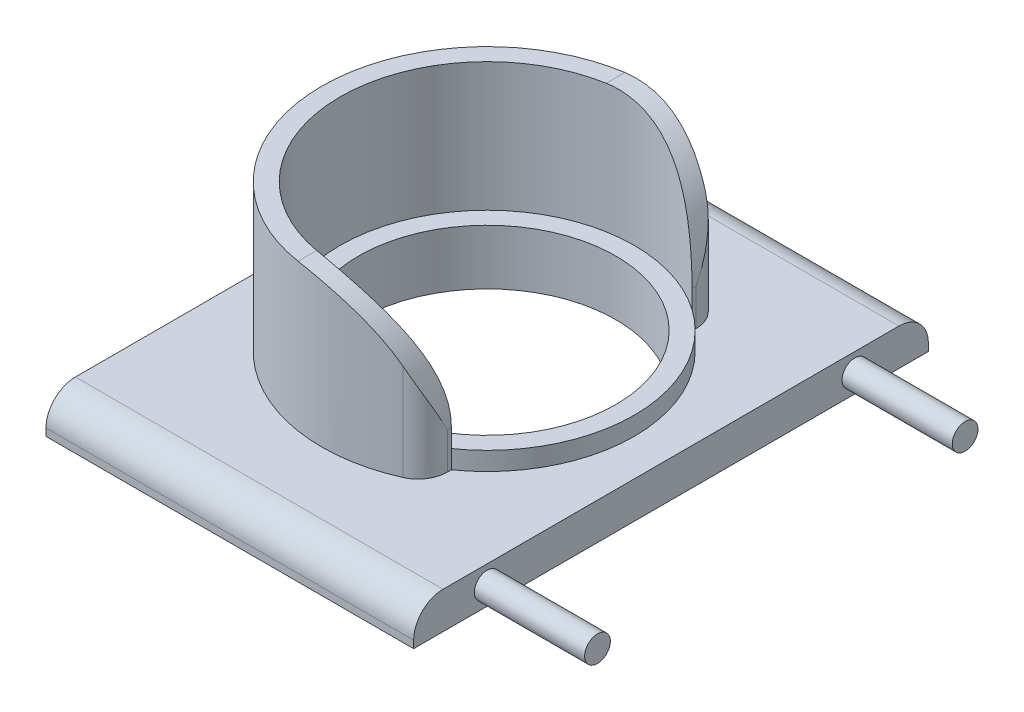
ISO-10303-21;
HEADER;
FILE_DESCRIPTION(('STEP AP214'),'2;1');
FILE_NAME('part.step','',(''),(''),'','','');
FILE_SCHEMA(('AUTOMOTIVE_DESIGN { 1 0 10303 214 1 1 1 1 }'));
ENDSEC;
DATA;
#1=APPLICATION_CONTEXT('core data for automotive mechanical design processes');
#2=APPLICATION_PROTOCOL_DEFINITION('international standard','automotive_design',2000,#1);
#3=PRODUCT_CONTEXT('',#1,'mechanical');
#4=PRODUCT('Part','Part','',(#3));
#5=PRODUCT_RELATED_PRODUCT_CATEGORY('part','',(#4));
#6=PRODUCT_DEFINITION_FORMATION('','',#4);
#7=PRODUCT_DEFINITION_CONTEXT('part definition',#1,'design');
#8=PRODUCT_DEFINITION('design','',#6,#7);
#9=PRODUCT_DEFINITION_SHAPE('','',#8);
#10=(LENGTH_UNIT() NAMED_UNIT(*) SI_UNIT(.MILLI.,.METRE.));
#11=(NAMED_UNIT(*) PLANE_ANGLE_UNIT() SI_UNIT($,.RADIAN.));
#12=(NAMED_UNIT(*) SI_UNIT($,.STERADIAN.) SOLID_ANGLE_UNIT());
#13=UNCERTAINTY_MEASURE_WITH_UNIT(LENGTH_MEASURE(1.E-05),#10,'distance_accuracy_value','');
#14=(GEOMETRIC_REPRESENTATION_CONTEXT(3) GLOBAL_UNCERTAINTY_ASSIGNED_CONTEXT((#13)) GLOBAL_UNIT_ASSIGNED_CONTEXT((#10,
#11,#12)) REPRESENTATION_CONTEXT('',''));
#15=CARTESIAN_POINT('',(0.,0.,0.));
#16=DIRECTION('',(0.,0.,1.));
#17=DIRECTION('',(1.,0.,0.));
#18=AXIS2_PLACEMENT_3D('',#15,#16,#17);
#19=CARTESIAN_POINT('',(-107.,20.,33.8230690505755));
#20=DIRECTION('',(0.,0.,1.));
#21=DIRECTION('',(1.,0.,0.));
#22=AXIS2_PLACEMENT_3D('',#19,#20,#21);
#23=CYLINDRICAL_SURFACE('',#22,30.);
#24=DIRECTION('',(0.,0.,-1.));
#25=VECTOR('',#24,1.);
#26=CARTESIAN_POINT('',(-107.,50.,33.8230690505755));
#27=LINE('',#26,#25);
#28=CARTESIAN_POINT('',(-107.,50.,44.4522215417857));
#29=VERTEX_POINT('',#28);
#30=CARTESIAN_POINT('',(-107.,50.,39.3827373350304));
#31=VERTEX_POINT('',#30);
#32=EDGE_CURVE('E246',#29,#31,#27,.T.);
#33=ORIENTED_EDGE('',*,*,#32,.F.);
#34=CARTESIAN_POINT('',(-81.7567567567568,36.2104494250608,41.1361650615108));
#35=CARTESIAN_POINT('',(-82.2080808379939,36.9132292250126,41.3363416194582));
#36=CARTESIAN_POINT('',(-82.6882150526422,37.5963835001399,41.5403678087963));
#37=CARTESIAN_POINT('',(-83.7037382903552,38.9203783184472,41.9491476986305));
#38=CARTESIAN_POINT('',(-84.2391416949642,39.5612077768329,42.1539015750265));
#39=CARTESIAN_POINT('',(-85.3663889202885,40.8012886558936,42.5584130455353));
#40=CARTESIAN_POINT('',(-85.9585890978726,41.4002304531987,42.7581276205865));
#41=CARTESIAN_POINT('',(-87.1936275992789,42.548132420231,43.1441222436832));
#42=CARTESIAN_POINT('',(-87.8364623069383,43.0970961532125,43.3304032492963));
#43=CARTESIAN_POINT('',(-89.1715727017559,44.1426596793003,43.6832137835042));
#44=CARTESIAN_POINT('',(-89.8639806843488,44.6391098784022,43.8496870459985));
#45=CARTESIAN_POINT('',(-91.2928576151953,45.573704517047,44.155626754506));
#46=CARTESIAN_POINT('',(-92.029327713164,46.0118474342122,44.2950924954079));
#47=CARTESIAN_POINT('',(-93.5388883908482,46.8240652937441,44.5402812089265));
#48=CARTESIAN_POINT('',(-94.3118438123261,47.1983561313643,44.6461189747726));
#49=CARTESIAN_POINT('',(-95.890711782247,47.8805113211543,44.8190143634826));
#50=CARTESIAN_POINT('',(-96.6966197857024,48.1883847974281,44.8860773151769));
#51=CARTESIAN_POINT('',(-98.2616596615149,48.7099340822624,44.9726245166167));
#52=CARTESIAN_POINT('',(-99.0186157210302,48.9295364610423,44.9957955038477));
#53=CARTESIAN_POINT('',(-100.547678617193,49.3084935612857,45.0031594868486));
#54=CARTESIAN_POINT('',(-101.31978483423,49.4678507412744,44.9873540733908));
#55=CARTESIAN_POINT('',(-102.873439568846,49.7252836061115,44.9149088040711));
#56=CARTESIAN_POINT('',(-103.655000404069,49.8232679495248,44.8582083525053));
#57=CARTESIAN_POINT('',(-105.219230080149,49.9573851657896,44.7032120992976));
#58=CARTESIAN_POINT('',(-106.001898790331,49.9935248090914,44.6049208522788));
#59=CARTESIAN_POINT('',(-107.484306289203,50.0043243019194,44.3789444143862));
#60=CARTESIAN_POINT('',(-108.184603721266,49.984701682258,44.2551193082252));
#61=CARTESIAN_POINT('',(-109.575676809992,49.8973514751151,43.9751047391845));
#62=CARTESIAN_POINT('',(-110.266451809571,49.829620584748,43.8189130546906));
#63=CARTESIAN_POINT('',(-111.633444943159,49.648035992749,43.4759580600407));
#64=CARTESIAN_POINT('',(-112.309677719686,49.5342312163978,43.2892273039187));
#65=CARTESIAN_POINT('',(-113.310607267186,49.3307389405995,42.987780757231));
#66=CARTESIAN_POINT('',(-113.641988811151,49.2574509116839,42.8837490177364));
#67=CARTESIAN_POINT('',(-114.2999583146,49.1002573225201,42.6688522917683));
#68=CARTESIAN_POINT('',(-114.626546611072,49.0163525127117,42.5579877885478));
#69=CARTESIAN_POINT('',(-114.950592277062,48.9272895799783,42.4438427874415));
#70=B_SPLINE_CURVE_WITH_KNOTS('',3,(#34,#35,#36,#37,#38,#39,#40,#41,#42,#43,#44,#45,#46,#47,#48,
#49,#50,#51,#52,#53,#54,#55,#56,#57,#58,#59,#60,#61,#62,#63,#64,#65,#66,#67,#68,#69),
.UNSPECIFIED.,.F.,.F.,(4,2,2,2,2,2,2,2,2,2,2,2,2,2,2,2,2,4),(0.,2.57588542593034,
5.15244281826887,7.74638037037042,10.3401328390783,12.941085625306,15.5421063079554,
18.1341502422074,20.7258378666131,23.0880685072971,25.4502027381299,27.8158442408992,
30.1812267484206,32.3130791313033,34.4450778912025,36.5748186218111,37.6395248004145,
38.7041557629998),.UNSPECIFIED.);
#71=CARTESIAN_POINT('',(-81.7567567567568,36.2104494250608,41.1361650615108));
#72=VERTEX_POINT('',#71);
#73=EDGE_CURVE('E213',#72,#29,#70,.T.);
#74=ORIENTED_EDGE('',*,*,#73,.F.);
#75=CARTESIAN_POINT('',(-77.,20.,33.8230690505755));
#76=CARTESIAN_POINT('',(-77.0000000027211,20.0102597284702,33.8283671506041));
#77=CARTESIAN_POINT('',(-77.0000052657517,20.0205195136878,33.8336652809302));
#78=CARTESIAN_POINT('',(-77.0009599545156,20.9512688374859,34.31430172969));
#79=CARTESIAN_POINT('',(-77.0442489036348,21.8721929880222,34.7898256869572));
#80=CARTESIAN_POINT('',(-77.2161500829284,23.7117189210807,35.7311968199383));
#81=CARTESIAN_POINT('',(-77.3448342595194,24.6303180891356,36.1970354940916));
#82=CARTESIAN_POINT('',(-77.6893793896831,26.4618431068924,37.1081872413296));
#83=CARTESIAN_POINT('',(-77.9052438215703,27.3747687287555,37.5534994946621));
#84=CARTESIAN_POINT('',(-78.2963157233976,28.7362062709723,38.1961004096242));
#85=CARTESIAN_POINT('',(-78.4378591543954,29.1886260167473,38.4060430585676));
#86=CARTESIAN_POINT('',(-78.7438266974139,30.0903567720104,38.8156275290006));
#87=CARTESIAN_POINT('',(-78.9082475066704,30.5396682204263,39.0152708316949));
#88=CARTESIAN_POINT('',(-79.2835963662446,31.4933460023048,39.4275628949265));
#89=CARTESIAN_POINT('',(-79.4977968795111,31.9971830947641,39.6384699965283));
#90=CARTESIAN_POINT('',(-79.956689919894,32.9985563393301,40.0406291434315));
#91=CARTESIAN_POINT('',(-80.2013665828317,33.49609562236,40.2318913209534));
#92=CARTESIAN_POINT('',(-80.5919422629483,34.2370168797612,40.5009477912704));
#93=CARTESIAN_POINT('',(-80.7262024394469,34.4833286507205,40.5877358745401));
#94=CARTESIAN_POINT('',(-81.0025945942487,34.9737815343758,40.7546499423415));
#95=CARTESIAN_POINT('',(-81.1447261095024,35.2179227737799,40.8347763180713));
#96=CARTESIAN_POINT('',(-81.4370928409925,35.7040865024024,40.9877714128147));
#97=CARTESIAN_POINT('',(-81.5873383424262,35.9461058279971,41.0606305705461));
#98=CARTESIAN_POINT('',(-81.8957966090314,36.4274380880269,41.1981893489625));
#99=CARTESIAN_POINT('',(-82.0540109785691,36.666750465502,41.2628873172987));
#100=CARTESIAN_POINT('',(-82.2161957768516,36.9045274476589,41.3230979869985));
#101=B_SPLINE_CURVE_WITH_KNOTS('',3,(#75,#76,#77,#78,#79,#80,#81,#82,#83,#84,#85,#86,#87,#88,
#89,#90,#91,#92,#93,#94,#95,#96,#97,#98,#99,#100),.UNSPECIFIED.,.F.,.F.,(4,2,2,2,2,2,2,2,2,2,2,
2,4),(0.,0.0346410197498268,3.14255467573778,6.25309011313507,9.36374966681858,10.9186106091243,
12.4732473115241,14.2323027896098,15.9904463988374,16.8712261457678,17.7519541337261,
18.6338259963175,19.5158761207878),.UNSPECIFIED.);
#102=CARTESIAN_POINT('',(-77.,20.,33.8230690505755));
#103=VERTEX_POINT('',#102);
#104=EDGE_CURVE('E221',#103,#72,#101,.T.);
#105=ORIENTED_EDGE('',*,*,#104,.F.);
#106=DIRECTION('',(0.,0.,-1.));
#107=VECTOR('',#106,1.);
#108=CARTESIAN_POINT('',(-77.,20.,33.8230690505755));
#109=LINE('',#108,#107);
#110=CARTESIAN_POINT('',(-77.,20.,32.7261363439071));
#111=VERTEX_POINT('',#110);
#112=EDGE_CURVE('E245',#111,#103,#109,.F.);
#113=ORIENTED_EDGE('',*,*,#112,.F.);
#114=CARTESIAN_POINT('',(-77.,20.,32.7261363439071));
#115=CARTESIAN_POINT('',(-76.9999889549258,20.386959075707,32.7261125566604));
#116=CARTESIAN_POINT('',(-77.0074866220145,20.7739089315374,32.7313975567596));
#117=CARTESIAN_POINT('',(-77.03741556169,21.5469197704808,32.75240948549));
#118=CARTESIAN_POINT('',(-77.0598457604845,21.9329808155049,32.7681356633002));
#119=CARTESIAN_POINT('',(-77.1195268566323,22.7030238876672,32.8098340091964));
#120=CARTESIAN_POINT('',(-77.1567632816497,23.0870075749228,32.8357961719169));
#121=CARTESIAN_POINT('',(-77.2458875139034,23.8524425333169,32.8976180520637));
#122=CARTESIAN_POINT('',(-77.2977754844878,24.233893776173,32.9334778798376));
#123=CARTESIAN_POINT('',(-77.4741890951267,25.367273608837,33.054628222278));
#124=CARTESIAN_POINT('',(-77.6199604937767,26.114553063103,33.1538450225408));
#125=CARTESIAN_POINT('',(-77.9663730603894,27.591050628555,33.3850626385745));
#126=CARTESIAN_POINT('',(-78.1670257581624,28.3202649093486,33.5170703427302));
#127=CARTESIAN_POINT('',(-78.6199828616259,29.7538498773841,33.8077941394443));
#128=CARTESIAN_POINT('',(-78.872092582104,30.458302805442,33.9664091729113));
#129=CARTESIAN_POINT('',(-79.4260549037415,31.8420027191063,34.3047816543356));
#130=CARTESIAN_POINT('',(-79.7279058039523,32.5212505656524,34.4845383792718));
#131=CARTESIAN_POINT('',(-80.3799750655116,33.8537280857741,34.8596670877113));
#132=CARTESIAN_POINT('',(-80.7303075279767,34.5068915543394,35.0550754363026));
#133=CARTESIAN_POINT('',(-81.476878946182,35.7834446453141,35.4552305182296));
#134=CARTESIAN_POINT('',(-81.8731211050655,36.4068321859512,35.6599779025497));
#135=CARTESIAN_POINT('',(-82.7591204992677,37.6934899498518,36.0974235951098));
#136=CARTESIAN_POINT('',(-83.2543952085359,38.3528151122656,36.3305746798826));
#137=CARTESIAN_POINT('',(-84.2981315044282,39.6291835878489,36.793713195605));
#138=CARTESIAN_POINT('',(-84.8465965636963,40.246224135884,37.0237004188744));
#139=CARTESIAN_POINT('',(-85.9946162198047,41.4349357090609,37.4730453360358));
#140=CARTESIAN_POINT('',(-86.5941657840403,42.006611192663,37.6924040736638));
#141=CARTESIAN_POINT('',(-87.8421526894268,43.1012052482461,38.113256577842));
#142=CARTESIAN_POINT('',(-88.4905901246537,43.6241237263985,38.3147503100124));
#143=CARTESIAN_POINT('',(-89.8639688883532,44.63977549592,38.7013251759046));
#144=CARTESIAN_POINT('',(-90.5910447048889,45.1300704444584,38.8852502841043));
#145=CARTESIAN_POINT('',(-92.0916021485331,46.0482784133476,39.217946064837));
#146=CARTESIAN_POINT('',(-92.8650870190576,46.4761870664868,39.3667142767433));
#147=CARTESIAN_POINT('',(-94.0546992510447,47.0668633268007,39.5577388115549));
#148=CARTESIAN_POINT('',(-94.4558295156411,47.2551050696201,39.6160280539255));
#149=CARTESIAN_POINT('',(-95.2672793957283,47.6141263730012,39.7211354294445));
#150=CARTESIAN_POINT('',(-95.6775976714817,47.7849084594661,39.7679552232598));
#151=CARTESIAN_POINT('',(-96.5064301436458,48.1084127661798,39.8493204072289));
#152=CARTESIAN_POINT('',(-96.9249432177692,48.2611374395265,39.8838674659137));
#153=CARTESIAN_POINT('',(-97.7690923254906,48.54801443222,39.9399807323197));
#154=CARTESIAN_POINT('',(-98.1947279463382,48.6821678236208,39.9615476895768));
#155=CARTESIAN_POINT('',(-99.351541825778,49.0185396987316,40.0013721209408));
#156=CARTESIAN_POINT('',(-100.088494703587,49.2028568523998,40.0067978602399));
#157=CARTESIAN_POINT('',(-101.573399284926,49.5148673889734,39.9759384549214));
#158=CARTESIAN_POINT('',(-102.321349601519,49.6425678498479,39.939658526201));
#159=CARTESIAN_POINT('',(-103.448866110984,49.7915225554283,39.8528432243256));
#160=CARTESIAN_POINT('',(-103.827009355448,49.834150513081,39.8183219722157));
#161=CARTESIAN_POINT('',(-104.583527788169,49.9049313762118,39.7383425189134));
#162=CARTESIAN_POINT('',(-104.96190297879,49.9330841315348,39.6928842042753));
#163=CARTESIAN_POINT('',(-105.718117984305,49.9749932815168,39.591018022106));
#164=CARTESIAN_POINT('',(-106.095957530402,49.9887440148541,39.5346058590242));
#165=CARTESIAN_POINT('',(-106.850103266492,50.0019987055914,39.4109418927887));
#166=CARTESIAN_POINT('',(-107.226409485034,50.0015029294776,39.3436902924141));
#167=CARTESIAN_POINT('',(-107.601531682741,49.9939687209722,39.2710671624326));
#168=B_SPLINE_CURVE_WITH_KNOTS('',3,(#114,#115,#116,#117,#118,#119,#120,#121,#122,#123,#124,
#125,#126,#127,#128,#129,#130,#131,#132,#133,#134,#135,#136,#137,#138,#139,#140,#141,#142,#143,
#144,#145,#146,#147,#148,#149,#150,#151,#152,#153,#154,#155,#156,#157,#158,#159,#160,#161,#162,
#163,#164,#165,#166,#167),.UNSPECIFIED.,.F.,.F.,(4,2,2,2,2,2,2,2,2,2,2,2,2,2,2,2,2,2,2,2,2,2,2,
2,2,2,4),(0.,1.16075251767294,2.32142157511961,3.48095891526601,4.64050918343661,
6.94061878404182,9.24121197787447,11.5332571751361,13.8252240099154,16.1226797375213,
18.4202958564435,20.9884119925289,23.5566959065023,26.1247270971439,28.6927632296314,
31.3770611302825,34.0615468490043,35.401827147645,36.7419132716139,38.0818171353359,
39.4216436189007,41.6972384793214,43.9725487746455,45.1184912698341,46.2644456519386,
47.4108503308407,48.5572335658419),.UNSPECIFIED.);
#169=EDGE_CURVE('E237',#31,#111,#168,.F.);
#170=ORIENTED_EDGE('',*,*,#169,.F.);
#171=EDGE_LOOP('',(#33,#74,#105,#113,#170));
#172=FACE_BOUND('',#171,.T.);
#173=ADVANCED_FACE('F35',(#172),#23,.T.);
#174=CARTESIAN_POINT('',(-107.,20.,33.8230690505755));
#175=DIRECTION('',(0.,0.,1.));
#176=DIRECTION('',(1.,0.,0.));
#177=AXIS2_PLACEMENT_3D('',#174,#175,#176);
#178=CYLINDRICAL_SURFACE('',#177,30.);
#179=DIRECTION('',(0.,0.,-1.));
#180=VECTOR('',#179,1.);
#181=CARTESIAN_POINT('',(-107.,50.,33.8230690505755));
#182=LINE('',#181,#180);
#183=CARTESIAN_POINT('',(-107.,50.,-39.3827373350304));
#184=VERTEX_POINT('',#183);
#185=CARTESIAN_POINT('',(-107.,50.,-44.4522215417858));
#186=VERTEX_POINT('',#185);
#187=EDGE_CURVE('E178',#184,#186,#182,.T.);
#188=ORIENTED_EDGE('',*,*,#187,.F.);
#189=CARTESIAN_POINT('',(-77.,20.,-32.7261363439071));
#190=CARTESIAN_POINT('',(-76.9999889549258,20.386959075707,-32.7261125566604));
#191=CARTESIAN_POINT('',(-77.0074866220145,20.7739089315374,-32.7313975567596));
#192=CARTESIAN_POINT('',(-77.03741556169,21.5469197704808,-32.75240948549));
#193=CARTESIAN_POINT('',(-77.0598457604845,21.9329808155049,-32.7681356633002));
#194=CARTESIAN_POINT('',(-77.1195268566323,22.7030238876672,-32.8098340091964));
#195=CARTESIAN_POINT('',(-77.1567632816497,23.0870075749228,-32.8357961719169));
#196=CARTESIAN_POINT('',(-77.2458875139034,23.8524425333169,-32.8976180520637));
#197=CARTESIAN_POINT('',(-77.2977754844878,24.233893776173,-32.9334778798376));
#198=CARTESIAN_POINT('',(-77.4741890951267,25.367273608837,-33.054628222278));
#199=CARTESIAN_POINT('',(-77.6199604937767,26.114553063103,-33.1538450225408));
#200=CARTESIAN_POINT('',(-77.9663730603894,27.591050628555,-33.3850626385745));
#201=CARTESIAN_POINT('',(-78.1670257581624,28.3202649093486,-33.5170703427302));
#202=CARTESIAN_POINT('',(-78.6199828616259,29.7538498773841,-33.8077941394443));
#203=CARTESIAN_POINT('',(-78.872092582104,30.458302805442,-33.9664091729113));
#204=CARTESIAN_POINT('',(-79.4260549037415,31.8420027191063,-34.3047816543356));
#205=CARTESIAN_POINT('',(-79.7279058039523,32.5212505656524,-34.4845383792718));
#206=CARTESIAN_POINT('',(-80.3799750655116,33.8537280857741,-34.8596670877113));
#207=CARTESIAN_POINT('',(-80.7303075279767,34.5068915543394,-35.0550754363026));
#208=CARTESIAN_POINT('',(-81.476878946182,35.7834446453141,-35.4552305182296));
#209=CARTESIAN_POINT('',(-81.8731211050655,36.4068321859512,-35.6599779025497));
#210=CARTESIAN_POINT('',(-82.7591204992677,37.6934899498518,-36.0974235951098));
#211=CARTESIAN_POINT('',(-83.2543952085359,38.3528151122656,-36.3305746798826));
#212=CARTESIAN_POINT('',(-84.2981315044282,39.6291835878489,-36.793713195605));
#213=CARTESIAN_POINT('',(-84.8465965636963,40.246224135884,-37.0237004188744));
#214=CARTESIAN_POINT('',(-85.9946162198047,41.4349357090609,-37.4730453360358));
#215=CARTESIAN_POINT('',(-86.5941657840403,42.006611192663,-37.6924040736638));
#216=CARTESIAN_POINT('',(-87.8421526894268,43.1012052482461,-38.113256577842));
#217=CARTESIAN_POINT('',(-88.4905901246537,43.6241237263985,-38.3147503100124));
#218=CARTESIAN_POINT('',(-89.8639688883532,44.63977549592,-38.7013251759046));
#219=CARTESIAN_POINT('',(-90.5910447048889,45.1300704444584,-38.8852502841043));
#220=CARTESIAN_POINT('',(-92.0916021485331,46.0482784133476,-39.217946064837));
#221=CARTESIAN_POINT('',(-92.8650870190576,46.4761870664868,-39.3667142767433));
#222=CARTESIAN_POINT('',(-94.0546992510447,47.0668633268007,-39.5577388115549));
#223=CARTESIAN_POINT('',(-94.4558295156411,47.2551050696201,-39.6160280539255));
#224=CARTESIAN_POINT('',(-95.2672793957283,47.6141263730012,-39.7211354294445));
#225=CARTESIAN_POINT('',(-95.6775976714817,47.7849084594661,-39.7679552232598));
#226=CARTESIAN_POINT('',(-96.5064301436458,48.1084127661798,-39.8493204072289));
#227=CARTESIAN_POINT('',(-96.9249432177692,48.2611374395265,-39.8838674659137));
#228=CARTESIAN_POINT('',(-97.7690923254906,48.54801443222,-39.9399807323197));
#229=CARTESIAN_POINT('',(-98.1947279463382,48.6821678236208,-39.9615476895768));
#230=CARTESIAN_POINT('',(-99.351541825778,49.0185396987316,-40.0013721209408));
#231=CARTESIAN_POINT('',(-100.088494703587,49.2028568523998,-40.0067978602399));
#232=CARTESIAN_POINT('',(-101.573399284926,49.5148673889734,-39.9759384549214));
#233=CARTESIAN_POINT('',(-102.321349601519,49.6425678498479,-39.939658526201));
#234=CARTESIAN_POINT('',(-103.448866110984,49.7915225554283,-39.8528432243256));
#235=CARTESIAN_POINT('',(-103.827009355448,49.834150513081,-39.8183219722157));
#236=CARTESIAN_POINT('',(-104.583527788169,49.9049313762118,-39.7383425189134));
#237=CARTESIAN_POINT('',(-104.96190297879,49.9330841315348,-39.6928842042753));
#238=CARTESIAN_POINT('',(-105.718117984305,49.9749932815168,-39.591018022106));
#239=CARTESIAN_POINT('',(-106.095957530402,49.9887440148541,-39.5346058590242));
#240=CARTESIAN_POINT('',(-106.850103266492,50.0019987055914,-39.4109418927887));
#241=CARTESIAN_POINT('',(-107.226409485034,50.0015029294776,-39.3436902924141));
#242=CARTESIAN_POINT('',(-107.601531682741,49.9939687209722,-39.2710671624326));
#243=B_SPLINE_CURVE_WITH_KNOTS('',3,(#189,#190,#191,#192,#193,#194,#195,#196,#197,#198,#199,
#200,#201,#202,#203,#204,#205,#206,#207,#208,#209,#210,#211,#212,#213,#214,#215,#216,#217,#218,
#219,#220,#221,#222,#223,#224,#225,#226,#227,#228,#229,#230,#231,#232,#233,#234,#235,#236,#237,
#238,#239,#240,#241,#242),.UNSPECIFIED.,.F.,.F.,(4,2,2,2,2,2,2,2,2,2,2,2,2,2,2,2,2,2,2,2,2,2,2,
2,2,2,4),(0.,1.16075251767294,2.32142157511961,3.48095891526601,4.64050918343661,
6.94061878404182,9.24121197787447,11.5332571751361,13.8252240099154,16.1226797375213,
18.4202958564435,20.9884119925289,23.5566959065023,26.1247270971439,28.6927632296314,
31.3770611302825,34.0615468490043,35.401827147645,36.7419132716139,38.0818171353359,
39.4216436189007,41.6972384793214,43.9725487746455,45.1184912698341,46.2644456519386,
47.4108503308407,48.5572335658419),.UNSPECIFIED.);
#244=CARTESIAN_POINT('',(-77.,20.,-32.7261363439071));
#245=VERTEX_POINT('',#244);
#246=EDGE_CURVE('E256',#245,#184,#243,.T.);
#247=ORIENTED_EDGE('',*,*,#246,.F.);
#248=DIRECTION('',(0.,0.,-1.));
#249=VECTOR('',#248,1.);
#250=CARTESIAN_POINT('',(-77.,20.,33.8230690505755));
#251=LINE('',#250,#249);
#252=CARTESIAN_POINT('',(-77.,20.,-33.8230690505755));
#253=VERTEX_POINT('',#252);
#254=EDGE_CURVE('E262',#253,#245,#251,.F.);
#255=ORIENTED_EDGE('',*,*,#254,.F.);
#256=CARTESIAN_POINT('',(-81.7567567567567,36.2104494250608,-41.1361650615108));
#257=CARTESIAN_POINT('',(-81.5781933129891,35.932388921913,-41.056955411345));
#258=CARTESIAN_POINT('',(-81.4049530552893,35.6525089055572,-40.9723197849342));
#259=CARTESIAN_POINT('',(-81.0691023548505,35.0895963272145,-40.7933139872259));
#260=CARTESIAN_POINT('',(-80.9064892943121,34.8065645618569,-40.6989462281246));
#261=CARTESIAN_POINT('',(-80.5919954307568,34.238071672771,-40.5016833106967));
#262=CARTESIAN_POINT('',(-80.4401007743405,33.952614239752,-40.3987995475434));
#263=CARTESIAN_POINT('',(-80.1467037699464,33.3792453971698,-40.1853349716711));
#264=CARTESIAN_POINT('',(-80.0052021324783,33.0913338213301,-40.0747536337187));
#265=CARTESIAN_POINT('',(-79.5970265404279,32.2263115809868,-39.73352117407));
#266=CARTESIAN_POINT('',(-79.3455965208838,31.6459438046107,-39.4926873575753));
#267=CARTESIAN_POINT('',(-78.8824892345372,30.4785580349994,-38.9895955854105));
#268=CARTESIAN_POINT('',(-78.6708276054157,29.8915375215851,-38.7273292599985));
#269=CARTESIAN_POINT('',(-78.2681046751026,28.6567235289215,-38.1605346466866));
#270=CARTESIAN_POINT('',(-78.0808871921455,28.0084349588,-37.8543555416163));
#271=CARTESIAN_POINT('',(-77.7517724673917,26.7075603428454,-37.2272696104634));
#272=CARTESIAN_POINT('',(-77.6098759187945,26.0549742314358,-36.9063625591977));
#273=CARTESIAN_POINT('',(-77.3704668816113,24.7468804260594,-36.2542925295843));
#274=CARTESIAN_POINT('',(-77.2729525840615,24.0913728522674,-35.9231299698257));
#275=CARTESIAN_POINT('',(-77.1216602378794,22.7786940630281,-35.2545645934942));
#276=CARTESIAN_POINT('',(-77.0678693772944,22.1215233915651,-34.917163634572));
#277=CARTESIAN_POINT('',(-77.0240760983692,21.2252191267239,-34.4554530300686));
#278=CARTESIAN_POINT('',(-77.0152655639961,20.9863186210824,-34.332240341795));
#279=CARTESIAN_POINT('',(-77.003358908945,20.5085358502566,-34.0856725144315));
#280=CARTESIAN_POINT('',(-77.0002608652103,20.2696536060145,-33.9623174372735));
#281=CARTESIAN_POINT('',(-77.0000052633228,20.0205195528302,-33.8336653019691));
#282=CARTESIAN_POINT('',(-77.0000000001974,20.0102597674963,-33.8283671715973));
#283=CARTESIAN_POINT('',(-77.,20.,-33.8230690505755));
#284=B_SPLINE_CURVE_WITH_KNOTS('',3,(#256,#257,#258,#259,#260,#261,#262,#263,#264,#265,#266,
#267,#268,#269,#270,#271,#272,#273,#274,#275,#276,#277,#278,#279,#280,#281,#282,#283),
.UNSPECIFIED.,.F.,.F.,(4,2,2,2,2,2,2,2,2,2,2,2,2,4),(0.,1.01930182209956,2.03835160555392,
3.0560591949341,4.07383629437762,6.10234766449599,8.13165502176952,10.3529627411298,
12.5743044345382,14.7955555807809,17.0161556154899,17.8229583559242,18.6294894441185,
18.6641304638683),.UNSPECIFIED.);
#285=CARTESIAN_POINT('',(-81.7567567567567,36.2104494250608,-41.1361650615108));
#286=VERTEX_POINT('',#285);
#287=EDGE_CURVE('E190',#286,#253,#284,.T.);
#288=ORIENTED_EDGE('',*,*,#287,.F.);
#289=CARTESIAN_POINT('',(-107.,50.,-44.4522215417858));
#290=CARTESIAN_POINT('',(-106.638464912638,50.000007933049,-44.5091622622156));
#291=CARTESIAN_POINT('',(-106.276233340198,49.9934646078557,-44.561674942791));
#292=CARTESIAN_POINT('',(-105.55107251881,49.9671841559139,-44.65780071203));
#293=CARTESIAN_POINT('',(-105.188143276261,49.9474471495783,-44.7014138819108));
#294=CARTESIAN_POINT('',(-104.462353585424,49.8946937086964,-44.7796897676333));
#295=CARTESIAN_POINT('',(-104.099493139067,49.8616801217435,-44.8143544001632));
#296=CARTESIAN_POINT('',(-103.374515846783,49.7823593229934,-44.8747708585988));
#297=CARTESIAN_POINT('',(-103.012399009498,49.7360519575634,-44.9005225814928));
#298=CARTESIAN_POINT('',(-101.931604294189,49.5776831772089,-44.964290462188));
#299=CARTESIAN_POINT('',(-101.214840109322,49.4459109878269,-44.9892093176299));
#300=CARTESIAN_POINT('',(-100.148404326483,49.209390693786,-45.0011635758042));
#301=CARTESIAN_POINT('',(-99.7943577482512,49.1240676825934,-45.0009102592353));
#302=CARTESIAN_POINT('',(-99.0896072430711,48.9405987299759,-44.9921698405249));
#303=CARTESIAN_POINT('',(-98.7389040851023,48.842449911511,-44.9836808882417));
#304=CARTESIAN_POINT('',(-97.6932914251439,48.5291820003466,-44.9462465875878));
#305=CARTESIAN_POINT('',(-97.0043679265594,48.2951280520674,-44.9053387942106));
#306=CARTESIAN_POINT('',(-95.6473943569286,47.7785087696882,-44.7941784982726));
#307=CARTESIAN_POINT('',(-94.9793459430274,47.4959395957672,-44.7239236723595));
#308=CARTESIAN_POINT('',(-93.9957952785651,47.0374146263333,-44.598868127396));
#309=CARTESIAN_POINT('',(-93.6708691785016,46.8787035776327,-44.5538757594632));
#310=CARTESIAN_POINT('',(-93.027763397453,46.5500839510923,-44.4577730549674));
#311=CARTESIAN_POINT('',(-92.7095819374228,46.3801783758772,-44.4066643559643));
#312=CARTESIAN_POINT('',(-91.7655752523328,45.8540370617483,-44.244793442758));
#313=CARTESIAN_POINT('',(-91.15026450394,45.4813658936748,-44.1254834060038));
#314=CARTESIAN_POINT('',(-89.9239806399205,44.677339348819,-43.8621098694517));
#315=CARTESIAN_POINT('',(-89.3144315883054,44.2441051083928,-43.7171781098562));
#316=CARTESIAN_POINT('',(-88.1318695732429,43.3355870010333,-43.4110645483371));
#317=CARTESIAN_POINT('',(-87.558857204227,42.8603024502652,-43.24988248214));
#318=CARTESIAN_POINT('',(-86.4512457904875,41.8700914419095,-42.9158024151209));
#319=CARTESIAN_POINT('',(-85.9166692590994,41.3551421110436,-42.7428976612282));
#320=CARTESIAN_POINT('',(-84.8881501154985,40.288301199365,-42.3901830316513));
#321=CARTESIAN_POINT('',(-84.3942111861267,39.7364062785074,-42.2103725322852));
#322=CARTESIAN_POINT('',(-83.3864399619303,38.5229888157209,-41.8248463130959));
#323=CARTESIAN_POINT('',(-82.8785641624171,37.8566038380366,-41.6188394481708));
#324=CARTESIAN_POINT('',(-81.9196488130768,36.4826470795377,-41.2113132155739));
#325=CARTESIAN_POINT('',(-81.4686118738924,35.7750734090826,-41.0097940543747));
#326=CARTESIAN_POINT('',(-80.8369056400967,34.6856649274128,-40.7164553655944));
#327=CARTESIAN_POINT('',(-80.6338156343853,34.3178622966207,-40.6201677815457));
#328=CARTESIAN_POINT('',(-80.2429396184361,33.5733705118495,-40.4314930309891));
#329=CARTESIAN_POINT('',(-80.0551483738515,33.1966844546251,-40.3391045356983));
#330=CARTESIAN_POINT('',(-79.6951224915312,32.4346808784817,-40.1590898826702));
#331=CARTESIAN_POINT('',(-79.5228928553185,32.0493606338309,-40.0714652596267));
#332=CARTESIAN_POINT('',(-79.1943729497809,31.2705728992621,-39.9018794080236));
#333=CARTESIAN_POINT('',(-79.0380891645953,30.8771021726947,-39.8199204876703));
#334=CARTESIAN_POINT('',(-78.8900058523545,30.4798964221666,-39.7412650413443));
#335=B_SPLINE_CURVE_WITH_KNOTS('',3,(#289,#290,#291,#292,#293,#294,#295,#296,#297,#298,#299,
#300,#301,#302,#303,#304,#305,#306,#307,#308,#309,#310,#311,#312,#313,#314,#315,#316,#317,#318,
#319,#320,#321,#322,#323,#324,#325,#326,#327,#328,#329,#330,#331,#332,#333,#334),.UNSPECIFIED.,
.F.,.F.,(4,2,2,2,2,2,2,2,2,2,2,2,2,2,2,2,2,2,2,2,2,2,4),(0.,1.09788530094467,2.19576058210314,
3.29340051376605,4.3910531310734,6.57537700117947,7.66766221852116,8.76019287538523,
10.9436896258828,13.1273592727143,14.2203226038981,15.3129939617591,17.4982594938345,
19.7812331090315,22.0642438574673,24.3485811384071,26.6331252131738,29.2187330345365,
31.8044595711496,33.0972673637941,34.389630958684,35.6824084544236,36.975709560878),.UNSPECIFIED.);
#336=EDGE_CURVE('E181',#186,#286,#335,.T.);
#337=ORIENTED_EDGE('',*,*,#336,.F.);
#338=EDGE_LOOP('',(#188,#247,#255,#288,#337));
#339=FACE_BOUND('',#338,.T.);
#340=ADVANCED_FACE('F197',(#339),#178,.T.);
#341=CARTESIAN_POINT('',(-100.,15.,0.));
#342=DIRECTION('',(0.,-1.,0.));
#343=DIRECTION('',(0.,0.,-1.));
#344=AXIS2_PLACEMENT_3D('',#341,#342,#343);
#345=CYLINDRICAL_SURFACE('',#344,40.);
#346=DIRECTION('',(0.,-1.,0.));
#347=VECTOR('',#346,1.);
#348=CARTESIAN_POINT('',(-77.,15.,32.7261363439071));
#349=LINE('',#348,#347);
#350=CARTESIAN_POINT('',(-77.,10.,32.7261363439071));
#351=VERTEX_POINT('',#350);
#352=CARTESIAN_POINT('',(-77.,15.,32.7261363439071));
#353=VERTEX_POINT('',#352);
#354=EDGE_CURVE('E175',#351,#353,#349,.F.);
#355=ORIENTED_EDGE('',*,*,#354,.F.);
#356=CARTESIAN_POINT('',(-100.,10.,0.));
#357=DIRECTION('',(0.,1.,0.));
#358=DIRECTION('',(0.,0.,1.));
#359=AXIS2_PLACEMENT_3D('',#356,#357,#358);
#360=CIRCLE('',#359,40.);
#361=CARTESIAN_POINT('',(-77.,10.,-32.7261363439071));
#362=VERTEX_POINT('',#361);
#363=EDGE_CURVE('E292',#351,#362,#360,.T.);
#364=ORIENTED_EDGE('',*,*,#363,.T.);
#365=DIRECTION('',(0.,-1.,0.));
#366=VECTOR('',#365,1.);
#367=CARTESIAN_POINT('',(-77.,15.,-32.7261363439071));
#368=LINE('',#367,#366);
#369=CARTESIAN_POINT('',(-77.,15.,-32.7261363439071));
#370=VERTEX_POINT('',#369);
#371=EDGE_CURVE('E172',#370,#362,#368,.T.);
#372=ORIENTED_EDGE('',*,*,#371,.F.);
#373=CARTESIAN_POINT('',(-100.,15.,0.));
#374=DIRECTION('',(0.,1.,0.));
#375=DIRECTION('',(0.,0.,1.));
#376=AXIS2_PLACEMENT_3D('',#373,#374,#375);
#377=CIRCLE('',#376,40.);
#378=EDGE_CURVE('E293',#353,#370,#377,.T.);
#379=ORIENTED_EDGE('',*,*,#378,.F.);
#380=EDGE_LOOP('',(#355,#364,#372,#379));
#381=FACE_BOUND('',#380,.T.);
#382=ADVANCED_FACE('F401',(#381),#345,.T.);
#383=CARTESIAN_POINT('',(-150.,10.,70.));
#384=DIRECTION('',(1.,0.,0.));
#385=DIRECTION('',(0.,0.,-1.));
#386=AXIS2_PLACEMENT_3D('',#383,#384,#385);
#387=PLANE('',#386);
#388=DIRECTION('',(0.,0.,1.));
#389=VECTOR('',#388,1.);
#390=CARTESIAN_POINT('',(-150.,10.,70.));
#391=LINE('',#390,#389);
#392=CARTESIAN_POINT('',(-150.,10.,-62.));
#393=VERTEX_POINT('',#392);
#394=CARTESIAN_POINT('',(-150.,10.,62.));
#395=VERTEX_POINT('',#394);
#396=EDGE_CURVE('E160',#393,#395,#391,.T.);
#397=ORIENTED_EDGE('',*,*,#396,.F.);
#398=CARTESIAN_POINT('',(-150.,2.,-62.));
#399=DIRECTION('',(1.,0.,0.));
#400=DIRECTION('',(0.,0.,-1.));
#401=AXIS2_PLACEMENT_3D('',#398,#399,#400);
#402=CIRCLE('',#401,8.);
#403=CARTESIAN_POINT('',(-150.,2.,-70.));
#404=VERTEX_POINT('',#403);
#405=EDGE_CURVE('E302',#393,#404,#402,.F.);
#406=ORIENTED_EDGE('',*,*,#405,.T.);
#407=DIRECTION('',(0.,-1.,0.));
#408=VECTOR('',#407,1.);
#409=CARTESIAN_POINT('',(-150.,10.,-70.));
#410=LINE('',#409,#408);
#411=CARTESIAN_POINT('',(-150.,0.,-70.));
#412=VERTEX_POINT('',#411);
#413=EDGE_CURVE('E164',#404,#412,#410,.T.);
#414=ORIENTED_EDGE('',*,*,#413,.T.);
#415=DIRECTION('',(0.,0.,1.));
#416=VECTOR('',#415,1.);
#417=CARTESIAN_POINT('',(-150.,0.,70.));
#418=LINE('',#417,#416);
#419=CARTESIAN_POINT('',(-150.,0.,70.));
#420=VERTEX_POINT('',#419);
#421=EDGE_CURVE('E159',#412,#420,#418,.T.);
#422=ORIENTED_EDGE('',*,*,#421,.T.);
#423=DIRECTION('',(0.,-1.,0.));
#424=VECTOR('',#423,1.);
#425=CARTESIAN_POINT('',(-150.,10.,70.));
#426=LINE('',#425,#424);
#427=CARTESIAN_POINT('',(-150.,2.,70.));
#428=VERTEX_POINT('',#427);
#429=EDGE_CURVE('E170',#428,#420,#426,.T.);
#430=ORIENTED_EDGE('',*,*,#429,.F.);
#431=CARTESIAN_POINT('',(-150.,2.,62.));
#432=DIRECTION('',(1.,0.,0.));
#433=DIRECTION('',(0.,0.,-1.));
#434=AXIS2_PLACEMENT_3D('',#431,#432,#433);
#435=CIRCLE('',#434,8.);
#436=EDGE_CURVE('E308',#428,#395,#435,.F.);
#437=ORIENTED_EDGE('',*,*,#436,.T.);
#438=EDGE_LOOP('',(#397,#406,#414,#422,#430,#437));
#439=FACE_BOUND('',#438,.T.);
#440=ADVANCED_FACE('F300',(#439),#387,.F.);
#441=CARTESIAN_POINT('',(150.,10.,70.));
#442=DIRECTION('',(0.,0.,-1.));
#443=DIRECTION('',(-1.,0.,0.));
#444=AXIS2_PLACEMENT_3D('',#441,#442,#443);
#445=PLANE('',#444);
#446=DIRECTION('',(0.,1.,0.));
#447=VECTOR('',#446,1.);
#448=CARTESIAN_POINT('',(-50.,0.,70.));
#449=LINE('',#448,#447);
#450=CARTESIAN_POINT('',(-50.,0.,70.));
#451=VERTEX_POINT('',#450);
#452=CARTESIAN_POINT('',(-50.,2.,70.));
#453=VERTEX_POINT('',#452);
#454=EDGE_CURVE('E145',#451,#453,#449,.T.);
#455=ORIENTED_EDGE('',*,*,#454,.T.);
#456=DIRECTION('',(1.,0.,0.));
#457=VECTOR('',#456,1.);
#458=CARTESIAN_POINT('',(-150.,2.,70.));
#459=LINE('',#458,#457);
#460=EDGE_CURVE('E11',#453,#428,#459,.F.);
#461=ORIENTED_EDGE('',*,*,#460,.T.);
#462=ORIENTED_EDGE('',*,*,#429,.T.);
#463=DIRECTION('',(1.,0.,0.));
#464=VECTOR('',#463,1.);
#465=CARTESIAN_POINT('',(150.,0.,70.));
#466=LINE('',#465,#464);
#467=EDGE_CURVE('E161',#420,#451,#466,.T.);
#468=ORIENTED_EDGE('',*,*,#467,.T.);
#469=EDGE_LOOP('',(#455,#461,#462,#468));
#470=FACE_BOUND('',#469,.T.);
#471=ADVANCED_FACE('F426',(#470),#445,.F.);
#472=CARTESIAN_POINT('',(150.,10.,-70.));
#473=DIRECTION('',(0.,0.,1.));
#474=DIRECTION('',(1.,0.,0.));
#475=AXIS2_PLACEMENT_3D('',#472,#473,#474);
#476=PLANE('',#475);
#477=ORIENTED_EDGE('',*,*,#413,.F.);
#478=DIRECTION('',(-1.,0.,0.));
#479=VECTOR('',#478,1.);
#480=CARTESIAN_POINT('',(-50.,2.,-70.));
#481=LINE('',#480,#479);
#482=CARTESIAN_POINT('',(-50.,2.,-70.));
#483=VERTEX_POINT('',#482);
#484=EDGE_CURVE('E58',#404,#483,#481,.F.);
#485=ORIENTED_EDGE('',*,*,#484,.T.);
#486=DIRECTION('',(0.,1.,0.));
#487=VECTOR('',#486,1.);
#488=CARTESIAN_POINT('',(-50.,0.,-70.));
#489=LINE('',#488,#487);
#490=CARTESIAN_POINT('',(-50.,0.,-70.));
#491=VERTEX_POINT('',#490);
#492=EDGE_CURVE('E143',#491,#483,#489,.T.);
#493=ORIENTED_EDGE('',*,*,#492,.F.);
#494=DIRECTION('',(-1.,0.,0.));
#495=VECTOR('',#494,1.);
#496=CARTESIAN_POINT('',(150.,0.,-70.));
#497=LINE('',#496,#495);
#498=EDGE_CURVE('E154',#491,#412,#497,.T.);
#499=ORIENTED_EDGE('',*,*,#498,.T.);
#500=EDGE_LOOP('',(#477,#485,#493,#499));
#501=FACE_BOUND('',#500,.T.);
#502=ADVANCED_FACE('F153',(#501),#476,.F.);
#503=CARTESIAN_POINT('',(0.,10.,0.));
#504=DIRECTION('',(0.,1.,0.));
#505=DIRECTION('',(0.,0.,1.));
#506=AXIS2_PLACEMENT_3D('',#503,#504,#505);
#507=PLANE('',#506);
#508=DIRECTION('',(0.,0.,1.));
#509=VECTOR('',#508,1.);
#510=CARTESIAN_POINT('',(-50.,10.,0.));
#511=LINE('',#510,#509);
#512=CARTESIAN_POINT('',(-50.,10.,-62.));
#513=VERTEX_POINT('',#512);
#514=CARTESIAN_POINT('',(-50.,10.,62.));
#515=VERTEX_POINT('',#514);
#516=EDGE_CURVE('E312',#513,#515,#511,.T.);
#517=ORIENTED_EDGE('',*,*,#516,.F.);
#518=DIRECTION('',(-1.,0.,0.));
#519=VECTOR('',#518,1.);
#520=CARTESIAN_POINT('',(-150.,10.,-62.));
#521=LINE('',#520,#519);
#522=EDGE_CURVE('E317',#513,#393,#521,.T.);
#523=ORIENTED_EDGE('',*,*,#522,.T.);
#524=ORIENTED_EDGE('',*,*,#396,.T.);
#525=DIRECTION('',(1.,0.,0.));
#526=VECTOR('',#525,1.);
#527=CARTESIAN_POINT('',(-50.,10.,62.));
#528=LINE('',#527,#526);
#529=EDGE_CURVE('E319',#395,#515,#528,.T.);
#530=ORIENTED_EDGE('',*,*,#529,.T.);
#531=EDGE_LOOP('',(#517,#523,#524,#530));
#532=FACE_BOUND('',#531,.T.);
#533=ORIENTED_EDGE('',*,*,#363,.F.);
#534=DIRECTION('',(0.,0.,-1.));
#535=VECTOR('',#534,1.);
#536=CARTESIAN_POINT('',(-77.,10.,32.7261363439071));
#537=LINE('',#536,#535);
#538=CARTESIAN_POINT('',(-77.,10.,33.8230690505755));
#539=VERTEX_POINT('',#538);
#540=EDGE_CURVE('E375',#539,#351,#537,.T.);
#541=ORIENTED_EDGE('',*,*,#540,.F.);
#542=CARTESIAN_POINT('',(-85.,10.,33.8230690505755));
#543=DIRECTION('',(0.,1.,0.));
#544=DIRECTION('',(0.,0.,1.));
#545=AXIS2_PLACEMENT_3D('',#542,#543,#544);
#546=CIRCLE('',#545,8.00000000000001);
#547=CARTESIAN_POINT('',(-81.7567567567568,10.,41.1361650615108));
#548=VERTEX_POINT('',#547);
#549=EDGE_CURVE('E372',#548,#539,#546,.T.);
#550=ORIENTED_EDGE('',*,*,#549,.F.);
#551=CARTESIAN_POINT('',(-100.,10.,0.));
#552=DIRECTION('',(0.,1.,0.));
#553=DIRECTION('',(0.,0.,1.));
#554=AXIS2_PLACEMENT_3D('',#551,#552,#553);
#555=CIRCLE('',#554,45.);
#556=CARTESIAN_POINT('',(-81.7567567567567,10.,-41.1361650615108));
#557=VERTEX_POINT('',#556);
#558=EDGE_CURVE('E369',#557,#548,#555,.T.);
#559=ORIENTED_EDGE('',*,*,#558,.F.);
#560=CARTESIAN_POINT('',(-85.,10.,-33.8230690505755));
#561=DIRECTION('',(0.,1.,0.));
#562=DIRECTION('',(0.,0.,1.));
#563=AXIS2_PLACEMENT_3D('',#560,#561,#562);
#564=CIRCLE('',#563,8.00000000000001);
#565=CARTESIAN_POINT('',(-77.,10.,-33.8230690505755));
#566=VERTEX_POINT('',#565);
#567=EDGE_CURVE('E379',#566,#557,#564,.T.);
#568=ORIENTED_EDGE('',*,*,#567,.F.);
#569=DIRECTION('',(0.,0.,-1.));
#570=VECTOR('',#569,1.);
#571=CARTESIAN_POINT('',(-77.,10.,-33.8230690505755));
#572=LINE('',#571,#570);
#573=EDGE_CURVE('E277',#362,#566,#572,.T.);
#574=ORIENTED_EDGE('',*,*,#573,.F.);
#575=EDGE_LOOP('',(#533,#541,#550,#559,#568,#574));
#576=FACE_BOUND('',#575,.T.);
#577=ADVANCED_FACE('F315',(#532,#576),#507,.T.);
#578=CARTESIAN_POINT('',(0.,0.,0.));
#579=DIRECTION('',(0.,1.,0.));
#580=DIRECTION('',(0.,0.,1.));
#581=AXIS2_PLACEMENT_3D('',#578,#579,#580);
#582=PLANE('',#581);
#583=CARTESIAN_POINT('',(-100.,0.,0.));
#584=DIRECTION('',(0.,1.,0.));
#585=DIRECTION('',(0.,0.,1.));
#586=AXIS2_PLACEMENT_3D('',#583,#584,#585);
#587=CIRCLE('',#586,35.);
#588=CARTESIAN_POINT('',(-100.,0.,35.));
#589=VERTEX_POINT('',#588);
#590=EDGE_CURVE('E228',#589,#589,#587,.T.);
#591=ORIENTED_EDGE('',*,*,#590,.T.);
#592=EDGE_LOOP('',(#591));
#593=FACE_BOUND('',#592,.T.);
#594=ORIENTED_EDGE('',*,*,#498,.F.);
#595=DIRECTION('',(0.,0.,1.));
#596=VECTOR('',#595,1.);
#597=CARTESIAN_POINT('',(-50.,0.,-70.));
#598=LINE('',#597,#596);
#599=EDGE_CURVE('E141',#491,#451,#598,.T.);
#600=ORIENTED_EDGE('',*,*,#599,.T.);
#601=ORIENTED_EDGE('',*,*,#467,.F.);
#602=ORIENTED_EDGE('',*,*,#421,.F.);
#603=EDGE_LOOP('',(#594,#600,#601,#602));
#604=FACE_BOUND('',#603,.T.);
#605=ADVANCED_FACE('F157',(#593,#604),#582,.F.);
#606=CARTESIAN_POINT('',(-100.,15.,0.));
#607=DIRECTION('',(0.,1.,0.));
#608=DIRECTION('',(0.,0.,1.));
#609=AXIS2_PLACEMENT_3D('',#606,#607,#608);
#610=PLANE('',#609);
#611=ORIENTED_EDGE('',*,*,#378,.T.);
#612=EDGE_CURVE('E296',#370,#353,#377,.T.);
#613=ORIENTED_EDGE('',*,*,#612,.T.);
#614=EDGE_LOOP('',(#611,#613));
#615=FACE_BOUND('',#614,.T.);
#616=CARTESIAN_POINT('',(-100.,15.,0.));
#617=DIRECTION('',(0.,1.,0.));
#618=DIRECTION('',(0.,0.,1.));
#619=AXIS2_PLACEMENT_3D('',#616,#617,#618);
#620=CIRCLE('',#619,35.);
#621=CARTESIAN_POINT('',(-100.,15.,35.));
#622=VERTEX_POINT('',#621);
#623=EDGE_CURVE('E289',#622,#622,#620,.T.);
#624=ORIENTED_EDGE('',*,*,#623,.F.);
#625=EDGE_LOOP('',(#624));
#626=FACE_BOUND('',#625,.T.);
#627=ADVANCED_FACE('F403',(#615,#626),#610,.T.);
#628=CARTESIAN_POINT('',(-100.,15.,0.));
#629=DIRECTION('',(0.,-1.,0.));
#630=DIRECTION('',(0.,0.,-1.));
#631=AXIS2_PLACEMENT_3D('',#628,#629,#630);
#632=CYLINDRICAL_SURFACE('',#631,35.);
#633=ORIENTED_EDGE('',*,*,#623,.T.);
#634=EDGE_LOOP('',(#633));
#635=FACE_BOUND('',#634,.T.);
#636=ORIENTED_EDGE('',*,*,#590,.F.);
#637=EDGE_LOOP('',(#636));
#638=FACE_BOUND('',#637,.T.);
#639=ADVANCED_FACE('F406',(#635,#638),#632,.F.);
#640=CARTESIAN_POINT('',(-85.,50.,33.8230690505755));
#641=DIRECTION('',(0.,-1.,0.));
#642=DIRECTION('',(0.,0.,-1.));
#643=AXIS2_PLACEMENT_3D('',#640,#641,#642);
#644=CYLINDRICAL_SURFACE('',#643,8.00000000000001);
#645=DIRECTION('',(0.,-1.,0.));
#646=VECTOR('',#645,1.);
#647=CARTESIAN_POINT('',(-77.,50.,33.8230690505755));
#648=LINE('',#647,#646);
#649=EDGE_CURVE('E287',#103,#539,#648,.T.);
#650=ORIENTED_EDGE('',*,*,#649,.F.);
#651=ORIENTED_EDGE('',*,*,#104,.T.);
#652=DIRECTION('',(0.,-1.,0.));
#653=VECTOR('',#652,1.);
#654=CARTESIAN_POINT('',(-81.7567567567568,50.,41.1361650615108));
#655=LINE('',#654,#653);
#656=EDGE_CURVE('E282',#72,#548,#655,.T.);
#657=ORIENTED_EDGE('',*,*,#656,.T.);
#658=ORIENTED_EDGE('',*,*,#549,.T.);
#659=EDGE_LOOP('',(#650,#651,#657,#658));
#660=FACE_BOUND('',#659,.T.);
#661=ADVANCED_FACE('F387',(#660),#644,.T.);
#662=CARTESIAN_POINT('',(-77.,50.,32.7261363439071));
#663=DIRECTION('',(-1.,0.,0.));
#664=DIRECTION('',(0.,0.,1.));
#665=AXIS2_PLACEMENT_3D('',#662,#663,#664);
#666=PLANE('',#665);
#667=DIRECTION('',(0.,-1.,0.));
#668=VECTOR('',#667,1.);
#669=CARTESIAN_POINT('',(-77.,50.,32.7261363439071));
#670=LINE('',#669,#668);
#671=EDGE_CURVE('E280',#111,#353,#670,.T.);
#672=ORIENTED_EDGE('',*,*,#671,.F.);
#673=ORIENTED_EDGE('',*,*,#112,.T.);
#674=ORIENTED_EDGE('',*,*,#649,.T.);
#675=ORIENTED_EDGE('',*,*,#540,.T.);
#676=ORIENTED_EDGE('',*,*,#354,.T.);
#677=EDGE_LOOP('',(#672,#673,#674,#675,#676));
#678=FACE_BOUND('',#677,.T.);
#679=ADVANCED_FACE('F253',(#678),#666,.F.);
#680=CARTESIAN_POINT('',(-100.,50.,0.));
#681=DIRECTION('',(0.,-1.,0.));
#682=DIRECTION('',(0.,0.,-1.));
#683=AXIS2_PLACEMENT_3D('',#680,#681,#682);
#684=CYLINDRICAL_SURFACE('',#683,40.);
#685=CARTESIAN_POINT('',(-100.,50.,0.));
#686=DIRECTION('',(0.,-1.,0.));
#687=DIRECTION('',(0.,0.,1.));
#688=AXIS2_PLACEMENT_3D('',#685,#686,#687);
#689=CIRCLE('',#688,40.);
#690=EDGE_CURVE('E366',#31,#184,#689,.T.);
#691=ORIENTED_EDGE('',*,*,#690,.F.);
#692=ORIENTED_EDGE('',*,*,#169,.T.);
#693=ORIENTED_EDGE('',*,*,#671,.T.);
#694=ORIENTED_EDGE('',*,*,#612,.F.);
#695=DIRECTION('',(0.,-1.,0.));
#696=VECTOR('',#695,1.);
#697=CARTESIAN_POINT('',(-77.,50.,-32.7261363439071));
#698=LINE('',#697,#696);
#699=EDGE_CURVE('E278',#245,#370,#698,.T.);
#700=ORIENTED_EDGE('',*,*,#699,.F.);
#701=ORIENTED_EDGE('',*,*,#246,.T.);
#702=EDGE_LOOP('',(#691,#692,#693,#694,#700,#701));
#703=FACE_BOUND('',#702,.T.);
#704=ADVANCED_FACE('F248',(#703),#684,.F.);
#705=CARTESIAN_POINT('',(-77.,50.,-33.8230690505755));
#706=DIRECTION('',(-1.,0.,0.));
#707=DIRECTION('',(0.,0.,1.));
#708=AXIS2_PLACEMENT_3D('',#705,#706,#707);
#709=PLANE('',#708);
#710=DIRECTION('',(0.,-1.,0.));
#711=VECTOR('',#710,1.);
#712=CARTESIAN_POINT('',(-77.,50.,-33.8230690505755));
#713=LINE('',#712,#711);
#714=EDGE_CURVE('E271',#253,#566,#713,.T.);
#715=ORIENTED_EDGE('',*,*,#714,.F.);
#716=ORIENTED_EDGE('',*,*,#254,.T.);
#717=ORIENTED_EDGE('',*,*,#699,.T.);
#718=ORIENTED_EDGE('',*,*,#371,.T.);
#719=ORIENTED_EDGE('',*,*,#573,.T.);
#720=EDGE_LOOP('',(#715,#716,#717,#718,#719));
#721=FACE_BOUND('',#720,.T.);
#722=ADVANCED_FACE('F252',(#721),#709,.F.);
#723=CARTESIAN_POINT('',(-85.,50.,-33.8230690505755));
#724=DIRECTION('',(0.,-1.,0.));
#725=DIRECTION('',(0.,0.,-1.));
#726=AXIS2_PLACEMENT_3D('',#723,#724,#725);
#727=CYLINDRICAL_SURFACE('',#726,8.00000000000001);
#728=DIRECTION('',(0.,-1.,0.));
#729=VECTOR('',#728,1.);
#730=CARTESIAN_POINT('',(-81.7567567567567,50.,-41.1361650615108));
#731=LINE('',#730,#729);
#732=EDGE_CURVE('E273',#286,#557,#731,.T.);
#733=ORIENTED_EDGE('',*,*,#732,.F.);
#734=ORIENTED_EDGE('',*,*,#287,.T.);
#735=ORIENTED_EDGE('',*,*,#714,.T.);
#736=ORIENTED_EDGE('',*,*,#567,.T.);
#737=EDGE_LOOP('',(#733,#734,#735,#736));
#738=FACE_BOUND('',#737,.T.);
#739=ADVANCED_FACE('F206',(#738),#727,.T.);
#740=CARTESIAN_POINT('',(-100.,50.,0.));
#741=DIRECTION('',(0.,-1.,0.));
#742=DIRECTION('',(0.,0.,-1.));
#743=AXIS2_PLACEMENT_3D('',#740,#741,#742);
#744=CYLINDRICAL_SURFACE('',#743,45.);
#745=ORIENTED_EDGE('',*,*,#656,.F.);
#746=ORIENTED_EDGE('',*,*,#73,.T.);
#747=CARTESIAN_POINT('',(-100.,50.,0.));
#748=DIRECTION('',(0.,1.,0.));
#749=DIRECTION('',(0.,0.,1.));
#750=AXIS2_PLACEMENT_3D('',#747,#748,#749);
#751=CIRCLE('',#750,45.);
#752=EDGE_CURVE('E368',#186,#29,#751,.T.);
#753=ORIENTED_EDGE('',*,*,#752,.F.);
#754=ORIENTED_EDGE('',*,*,#336,.T.);
#755=ORIENTED_EDGE('',*,*,#732,.T.);
#756=ORIENTED_EDGE('',*,*,#558,.T.);
#757=EDGE_LOOP('',(#745,#746,#753,#754,#755,#756));
#758=FACE_BOUND('',#757,.T.);
#759=ADVANCED_FACE('F201',(#758),#744,.T.);
#760=CARTESIAN_POINT('',(-85.,50.,33.8230690505755));
#761=DIRECTION('',(0.,1.,0.));
#762=DIRECTION('',(0.,0.,1.));
#763=AXIS2_PLACEMENT_3D('',#760,#761,#762);
#764=PLANE('',#763);
#765=ORIENTED_EDGE('',*,*,#752,.T.);
#766=ORIENTED_EDGE('',*,*,#32,.T.);
#767=ORIENTED_EDGE('',*,*,#690,.T.);
#768=ORIENTED_EDGE('',*,*,#187,.T.);
#769=EDGE_LOOP('',(#765,#766,#767,#768));
#770=FACE_BOUND('',#769,.T.);
#771=ADVANCED_FACE('F205',(#770),#764,.T.);
#772=CARTESIAN_POINT('',(-50.,0.,-70.));
#773=DIRECTION('',(-1.,0.,0.));
#774=DIRECTION('',(0.,0.,1.));
#775=AXIS2_PLACEMENT_3D('',#772,#773,#774);
#776=PLANE('',#775);
#777=CARTESIAN_POINT('',(-50.,5.,-50.));
#778=DIRECTION('',(-1.,0.,0.));
#779=DIRECTION('',(0.,0.,1.));
#780=AXIS2_PLACEMENT_3D('',#777,#778,#779);
#781=CIRCLE('',#780,3.50000000000001);
#782=CARTESIAN_POINT('',(-50.,5.,-46.5));
#783=VERTEX_POINT('',#782);
#784=EDGE_CURVE('E322',#783,#783,#781,.F.);
#785=ORIENTED_EDGE('',*,*,#784,.F.);
#786=EDGE_LOOP('',(#785));
#787=FACE_BOUND('',#786,.T.);
#788=CARTESIAN_POINT('',(-50.,5.,50.));
#789=DIRECTION('',(-1.,0.,0.));
#790=DIRECTION('',(0.,0.,1.));
#791=AXIS2_PLACEMENT_3D('',#788,#789,#790);
#792=CIRCLE('',#791,3.5);
#793=CARTESIAN_POINT('',(-50.,5.,53.5));
#794=VERTEX_POINT('',#793);
#795=EDGE_CURVE('E220',#794,#794,#792,.F.);
#796=ORIENTED_EDGE('',*,*,#795,.F.);
#797=EDGE_LOOP('',(#796));
#798=FACE_BOUND('',#797,.T.);
#799=ORIENTED_EDGE('',*,*,#492,.T.);
#800=CARTESIAN_POINT('',(-50.,2.,-62.));
#801=DIRECTION('',(-1.,0.,0.));
#802=DIRECTION('',(0.,0.,1.));
#803=AXIS2_PLACEMENT_3D('',#800,#801,#802);
#804=CIRCLE('',#803,8.);
#805=EDGE_CURVE('E43',#483,#513,#804,.F.);
#806=ORIENTED_EDGE('',*,*,#805,.T.);
#807=ORIENTED_EDGE('',*,*,#516,.T.);
#808=CARTESIAN_POINT('',(-50.,2.,62.));
#809=DIRECTION('',(-1.,0.,0.));
#810=DIRECTION('',(0.,0.,1.));
#811=AXIS2_PLACEMENT_3D('',#808,#809,#810);
#812=CIRCLE('',#811,8.);
#813=EDGE_CURVE('E50',#515,#453,#812,.F.);
#814=ORIENTED_EDGE('',*,*,#813,.T.);
#815=ORIENTED_EDGE('',*,*,#454,.F.);
#816=ORIENTED_EDGE('',*,*,#599,.F.);
#817=EDGE_LOOP('',(#799,#806,#807,#814,#815,#816));
#818=FACE_BOUND('',#817,.T.);
#819=ADVANCED_FACE('F142',(#787,#798,#818),#776,.F.);
#820=CARTESIAN_POINT('',(-20.,5.,50.));
#821=DIRECTION('',(-1.,0.,0.));
#822=DIRECTION('',(0.,0.,1.));
#823=AXIS2_PLACEMENT_3D('',#820,#821,#822);
#824=CYLINDRICAL_SURFACE('',#823,3.5);
#825=CARTESIAN_POINT('',(-20.,5.,50.));
#826=DIRECTION('',(1.,0.,0.));
#827=DIRECTION('',(0.,0.,-1.));
#828=AXIS2_PLACEMENT_3D('',#825,#826,#827);
#829=CIRCLE('',#828,3.5);
#830=CARTESIAN_POINT('',(-20.,5.,46.5));
#831=VERTEX_POINT('',#830);
#832=EDGE_CURVE('E150',#831,#831,#829,.T.);
#833=ORIENTED_EDGE('',*,*,#832,.F.);
#834=EDGE_LOOP('',(#833));
#835=FACE_BOUND('',#834,.T.);
#836=ORIENTED_EDGE('',*,*,#795,.T.);
#837=EDGE_LOOP('',(#836));
#838=FACE_BOUND('',#837,.T.);
#839=ADVANCED_FACE('F329',(#835,#838),#824,.T.);
#840=CARTESIAN_POINT('',(-20.,5.,50.));
#841=DIRECTION('',(1.,0.,0.));
#842=DIRECTION('',(0.,0.,-1.));
#843=AXIS2_PLACEMENT_3D('',#840,#841,#842);
#844=PLANE('',#843);
#845=ORIENTED_EDGE('',*,*,#832,.T.);
#846=EDGE_LOOP('',(#845));
#847=FACE_BOUND('',#846,.T.);
#848=ADVANCED_FACE('F338',(#847),#844,.T.);
#849=CARTESIAN_POINT('',(-20.,5.,-50.));
#850=DIRECTION('',(-1.,0.,0.));
#851=DIRECTION('',(0.,0.,1.));
#852=AXIS2_PLACEMENT_3D('',#849,#850,#851);
#853=CYLINDRICAL_SURFACE('',#852,3.50000000000001);
#854=CARTESIAN_POINT('',(-20.,5.,-50.));
#855=DIRECTION('',(1.,0.,0.));
#856=DIRECTION('',(0.,0.,-1.));
#857=AXIS2_PLACEMENT_3D('',#854,#855,#856);
#858=CIRCLE('',#857,3.50000000000001);
#859=CARTESIAN_POINT('',(-20.,5.,-53.5));
#860=VERTEX_POINT('',#859);
#861=EDGE_CURVE('E360',#860,#860,#858,.T.);
#862=ORIENTED_EDGE('',*,*,#861,.F.);
#863=EDGE_LOOP('',(#862));
#864=FACE_BOUND('',#863,.T.);
#865=ORIENTED_EDGE('',*,*,#784,.T.);
#866=EDGE_LOOP('',(#865));
#867=FACE_BOUND('',#866,.T.);
#868=ADVANCED_FACE('F347',(#864,#867),#853,.T.);
#869=CARTESIAN_POINT('',(-20.,5.,-50.));
#870=DIRECTION('',(1.,0.,0.));
#871=DIRECTION('',(0.,0.,-1.));
#872=AXIS2_PLACEMENT_3D('',#869,#870,#871);
#873=PLANE('',#872);
#874=ORIENTED_EDGE('',*,*,#861,.T.);
#875=EDGE_LOOP('',(#874));
#876=FACE_BOUND('',#875,.T.);
#877=ADVANCED_FACE('F351',(#876),#873,.T.);
#878=CARTESIAN_POINT('',(0.,2.,-62.));
#879=DIRECTION('',(1.,0.,0.));
#880=DIRECTION('',(0.,0.,-1.));
#881=AXIS2_PLACEMENT_3D('',#878,#879,#880);
#882=CYLINDRICAL_SURFACE('',#881,8.);
#883=ORIENTED_EDGE('',*,*,#805,.F.);
#884=ORIENTED_EDGE('',*,*,#484,.F.);
#885=ORIENTED_EDGE('',*,*,#405,.F.);
#886=ORIENTED_EDGE('',*,*,#522,.F.);
#887=EDGE_LOOP('',(#883,#884,#885,#886));
#888=FACE_BOUND('',#887,.T.);
#889=ADVANCED_FACE('F233',(#888),#882,.T.);
#890=CARTESIAN_POINT('',(0.,2.,62.));
#891=DIRECTION('',(-1.,0.,0.));
#892=DIRECTION('',(0.,0.,1.));
#893=AXIS2_PLACEMENT_3D('',#890,#891,#892);
#894=CYLINDRICAL_SURFACE('',#893,8.);
#895=ORIENTED_EDGE('',*,*,#436,.F.);
#896=ORIENTED_EDGE('',*,*,#460,.F.);
#897=ORIENTED_EDGE('',*,*,#813,.F.);
#898=ORIENTED_EDGE('',*,*,#529,.F.);
#899=EDGE_LOOP('',(#895,#896,#897,#898));
#900=FACE_BOUND('',#899,.T.);
#901=ADVANCED_FACE('F37',(#900),#894,.T.);
#902=CLOSED_SHELL('',(#173,#340,#382,#440,#471,#502,#577,#605,#627,#639,#661,#679,#704,#722,
#739,#759,#771,#819,#839,#848,#868,#877,#889,#901));
#903=MANIFOLD_SOLID_BREP('B2',#902);
#904=ADVANCED_BREP_SHAPE_REPRESENTATION('',(#18,#903),#14);
#905=SHAPE_DEFINITION_REPRESENTATION(#9,#904);
ENDSEC;
END-ISO-10303-21;
